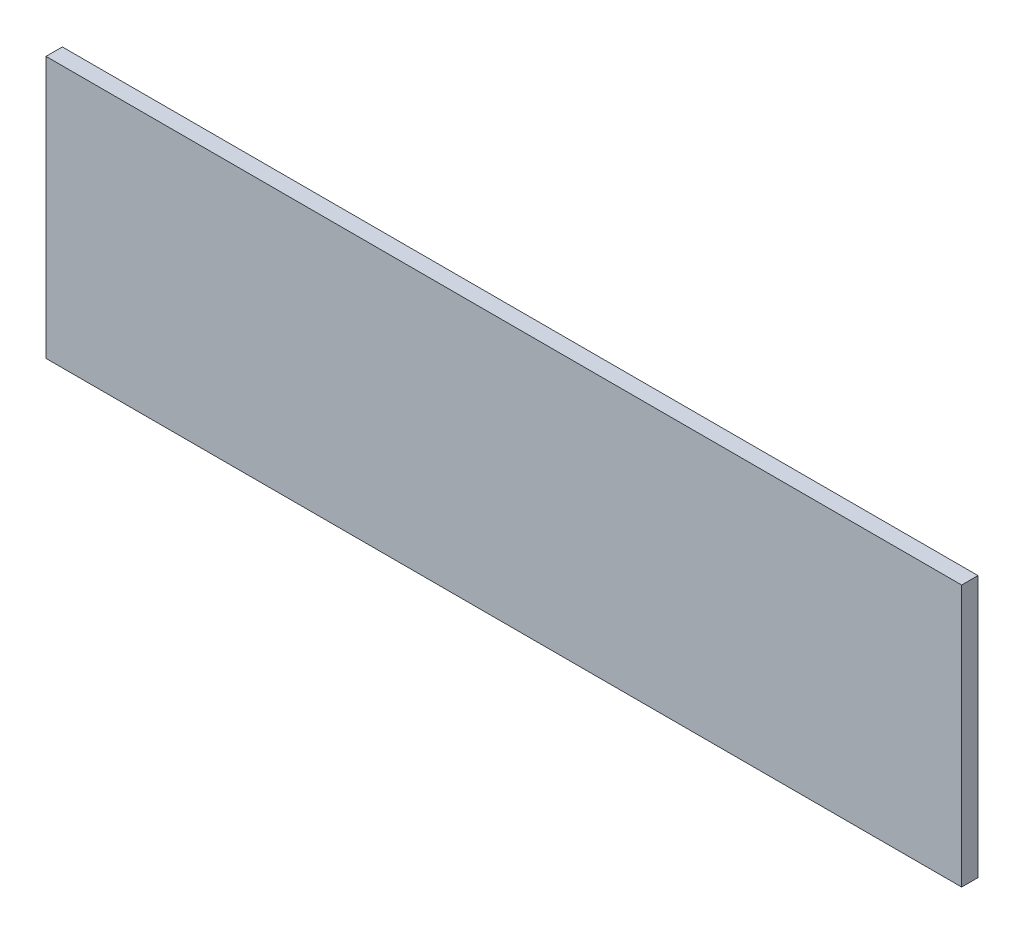
ISO-10303-21;
HEADER;
FILE_DESCRIPTION(('STEP AP214'),'2;1');
FILE_NAME('part.step','',(''),(''),'','','');
FILE_SCHEMA(('AUTOMOTIVE_DESIGN { 1 0 10303 214 1 1 1 1 }'));
ENDSEC;
DATA;
#1=APPLICATION_CONTEXT('core data for automotive mechanical design processes');
#2=APPLICATION_PROTOCOL_DEFINITION('international standard','automotive_design',2000,#1);
#3=PRODUCT_CONTEXT('',#1,'mechanical');
#4=PRODUCT('Part','Part','',(#3));
#5=PRODUCT_RELATED_PRODUCT_CATEGORY('part','',(#4));
#6=PRODUCT_DEFINITION_FORMATION('','',#4);
#7=PRODUCT_DEFINITION_CONTEXT('part definition',#1,'design');
#8=PRODUCT_DEFINITION('design','',#6,#7);
#9=PRODUCT_DEFINITION_SHAPE('','',#8);
#10=(LENGTH_UNIT() NAMED_UNIT(*) SI_UNIT(.MILLI.,.METRE.));
#11=(NAMED_UNIT(*) PLANE_ANGLE_UNIT() SI_UNIT($,.RADIAN.));
#12=(NAMED_UNIT(*) SI_UNIT($,.STERADIAN.) SOLID_ANGLE_UNIT());
#13=UNCERTAINTY_MEASURE_WITH_UNIT(LENGTH_MEASURE(1.E-05),#10,'distance_accuracy_value','');
#14=(GEOMETRIC_REPRESENTATION_CONTEXT(3) GLOBAL_UNCERTAINTY_ASSIGNED_CONTEXT((#13)) GLOBAL_UNIT_ASSIGNED_CONTEXT((#10,
#11,#12)) REPRESENTATION_CONTEXT('',''));
#15=CARTESIAN_POINT('',(0.,0.,0.));
#16=DIRECTION('',(0.,0.,1.));
#17=DIRECTION('',(1.,0.,0.));
#18=AXIS2_PLACEMENT_3D('',#15,#16,#17);
#19=CARTESIAN_POINT('',(0.,0.,3.175));
#20=DIRECTION('',(1.,0.,0.));
#21=DIRECTION('',(0.,1.,0.));
#22=AXIS2_PLACEMENT_3D('',#19,#20,#21);
#23=PLANE('',#22);
#24=DIRECTION('',(0.,-1.,0.));
#25=VECTOR('',#24,1.);
#26=CARTESIAN_POINT('',(0.,0.,0.));
#27=LINE('',#26,#25);
#28=CARTESIAN_POINT('',(0.,50.8,0.));
#29=VERTEX_POINT('',#28);
#30=CARTESIAN_POINT('',(0.,0.,0.));
#31=VERTEX_POINT('',#30);
#32=EDGE_CURVE('E107',#29,#31,#27,.T.);
#33=ORIENTED_EDGE('',*,*,#32,.T.);
#34=DIRECTION('',(0.,0.,-1.));
#35=VECTOR('',#34,1.);
#36=CARTESIAN_POINT('',(0.,0.,3.175));
#37=LINE('',#36,#35);
#38=CARTESIAN_POINT('',(0.,0.,3.175));
#39=VERTEX_POINT('',#38);
#40=EDGE_CURVE('E11',#39,#31,#37,.T.);
#41=ORIENTED_EDGE('',*,*,#40,.F.);
#42=DIRECTION('',(0.,-1.,0.));
#43=VECTOR('',#42,1.);
#44=CARTESIAN_POINT('',(0.,0.,3.175));
#45=LINE('',#44,#43);
#46=CARTESIAN_POINT('',(0.,50.8,3.175));
#47=VERTEX_POINT('',#46);
#48=EDGE_CURVE('E91',#47,#39,#45,.T.);
#49=ORIENTED_EDGE('',*,*,#48,.F.);
#50=DIRECTION('',(0.,0.,-1.));
#51=VECTOR('',#50,1.);
#52=CARTESIAN_POINT('',(0.,50.8,3.175));
#53=LINE('',#52,#51);
#54=EDGE_CURVE('E103',#47,#29,#53,.T.);
#55=ORIENTED_EDGE('',*,*,#54,.T.);
#56=EDGE_LOOP('',(#33,#41,#49,#55));
#57=FACE_BOUND('',#56,.T.);
#58=ADVANCED_FACE('F39',(#57),#23,.F.);
#59=CARTESIAN_POINT('',(0.,0.,3.175));
#60=DIRECTION('',(0.,1.,0.));
#61=DIRECTION('',(0.,0.,1.));
#62=AXIS2_PLACEMENT_3D('',#59,#60,#61);
#63=PLANE('',#62);
#64=DIRECTION('',(1.,0.,0.));
#65=VECTOR('',#64,1.);
#66=CARTESIAN_POINT('',(0.,0.,0.));
#67=LINE('',#66,#65);
#68=CARTESIAN_POINT('',(177.8,0.,0.));
#69=VERTEX_POINT('',#68);
#70=EDGE_CURVE('E96',#31,#69,#67,.T.);
#71=ORIENTED_EDGE('',*,*,#70,.T.);
#72=DIRECTION('',(0.,0.,-1.));
#73=VECTOR('',#72,1.);
#74=CARTESIAN_POINT('',(177.8,0.,3.175));
#75=LINE('',#74,#73);
#76=CARTESIAN_POINT('',(177.8,0.,3.175));
#77=VERTEX_POINT('',#76);
#78=EDGE_CURVE('E48',#77,#69,#75,.T.);
#79=ORIENTED_EDGE('',*,*,#78,.F.);
#80=DIRECTION('',(1.,0.,0.));
#81=VECTOR('',#80,1.);
#82=CARTESIAN_POINT('',(0.,0.,3.175));
#83=LINE('',#82,#81);
#84=EDGE_CURVE('E86',#39,#77,#83,.T.);
#85=ORIENTED_EDGE('',*,*,#84,.F.);
#86=ORIENTED_EDGE('',*,*,#40,.T.);
#87=EDGE_LOOP('',(#71,#79,#85,#86));
#88=FACE_BOUND('',#87,.T.);
#89=ADVANCED_FACE('F95',(#88),#63,.F.);
#90=CARTESIAN_POINT('',(177.8,0.,3.175));
#91=DIRECTION('',(-1.,0.,0.));
#92=DIRECTION('',(0.,-1.,0.));
#93=AXIS2_PLACEMENT_3D('',#90,#91,#92);
#94=PLANE('',#93);
#95=DIRECTION('',(0.,1.,0.));
#96=VECTOR('',#95,1.);
#97=CARTESIAN_POINT('',(177.8,0.,0.));
#98=LINE('',#97,#96);
#99=CARTESIAN_POINT('',(177.8,50.8,0.));
#100=VERTEX_POINT('',#99);
#101=EDGE_CURVE('E73',#69,#100,#98,.T.);
#102=ORIENTED_EDGE('',*,*,#101,.T.);
#103=DIRECTION('',(0.,0.,-1.));
#104=VECTOR('',#103,1.);
#105=CARTESIAN_POINT('',(177.8,50.8,3.175));
#106=LINE('',#105,#104);
#107=CARTESIAN_POINT('',(177.8,50.8,3.175));
#108=VERTEX_POINT('',#107);
#109=EDGE_CURVE('E98',#108,#100,#106,.T.);
#110=ORIENTED_EDGE('',*,*,#109,.F.);
#111=DIRECTION('',(0.,1.,0.));
#112=VECTOR('',#111,1.);
#113=CARTESIAN_POINT('',(177.8,0.,3.175));
#114=LINE('',#113,#112);
#115=EDGE_CURVE('E89',#77,#108,#114,.T.);
#116=ORIENTED_EDGE('',*,*,#115,.F.);
#117=ORIENTED_EDGE('',*,*,#78,.T.);
#118=EDGE_LOOP('',(#102,#110,#116,#117));
#119=FACE_BOUND('',#118,.T.);
#120=ADVANCED_FACE('F99',(#119),#94,.F.);
#121=CARTESIAN_POINT('',(0.,50.8,3.175));
#122=DIRECTION('',(0.,-1.,0.));
#123=DIRECTION('',(0.,0.,-1.));
#124=AXIS2_PLACEMENT_3D('',#121,#122,#123);
#125=PLANE('',#124);
#126=DIRECTION('',(-1.,0.,0.));
#127=VECTOR('',#126,1.);
#128=CARTESIAN_POINT('',(0.,50.8,0.));
#129=LINE('',#128,#127);
#130=EDGE_CURVE('E79',#100,#29,#129,.T.);
#131=ORIENTED_EDGE('',*,*,#130,.T.);
#132=ORIENTED_EDGE('',*,*,#54,.F.);
#133=DIRECTION('',(-1.,0.,0.));
#134=VECTOR('',#133,1.);
#135=CARTESIAN_POINT('',(0.,50.8,3.175));
#136=LINE('',#135,#134);
#137=EDGE_CURVE('E56',#108,#47,#136,.T.);
#138=ORIENTED_EDGE('',*,*,#137,.F.);
#139=ORIENTED_EDGE('',*,*,#109,.T.);
#140=EDGE_LOOP('',(#131,#132,#138,#139));
#141=FACE_BOUND('',#140,.T.);
#142=ADVANCED_FACE('F120',(#141),#125,.F.);
#143=CARTESIAN_POINT('',(0.,0.,3.175));
#144=DIRECTION('',(0.,0.,-1.));
#145=DIRECTION('',(-1.,0.,0.));
#146=AXIS2_PLACEMENT_3D('',#143,#144,#145);
#147=PLANE('',#146);
#148=ORIENTED_EDGE('',*,*,#48,.T.);
#149=ORIENTED_EDGE('',*,*,#84,.T.);
#150=ORIENTED_EDGE('',*,*,#115,.T.);
#151=ORIENTED_EDGE('',*,*,#137,.T.);
#152=EDGE_LOOP('',(#148,#149,#150,#151));
#153=FACE_BOUND('',#152,.T.);
#154=ADVANCED_FACE('F87',(#153),#147,.F.);
#155=CARTESIAN_POINT('',(0.,0.,0.));
#156=DIRECTION('',(0.,0.,-1.));
#157=DIRECTION('',(-1.,0.,0.));
#158=AXIS2_PLACEMENT_3D('',#155,#156,#157);
#159=PLANE('',#158);
#160=ORIENTED_EDGE('',*,*,#32,.F.);
#161=ORIENTED_EDGE('',*,*,#130,.F.);
#162=ORIENTED_EDGE('',*,*,#101,.F.);
#163=ORIENTED_EDGE('',*,*,#70,.F.);
#164=EDGE_LOOP('',(#160,#161,#162,#163));
#165=FACE_BOUND('',#164,.T.);
#166=ADVANCED_FACE('F123',(#165),#159,.T.);
#167=CLOSED_SHELL('',(#58,#89,#120,#142,#154,#166));
#168=MANIFOLD_SOLID_BREP('B2',#167);
#169=ADVANCED_BREP_SHAPE_REPRESENTATION('',(#18,#168),#14);
#170=SHAPE_DEFINITION_REPRESENTATION(#9,#169);
ENDSEC;
END-ISO-10303-21;
